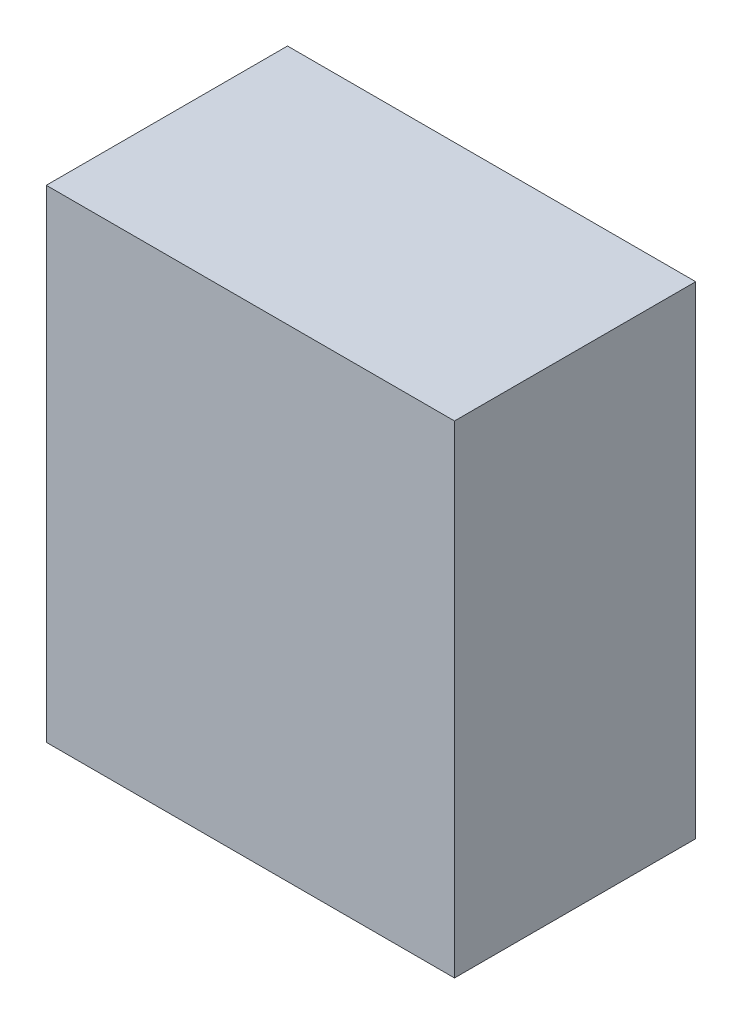
ISO-10303-21;
HEADER;
FILE_DESCRIPTION(('STEP AP214'),'2;1');
FILE_NAME('part.step','',(''),(''),'','','');
FILE_SCHEMA(('AUTOMOTIVE_DESIGN { 1 0 10303 214 1 1 1 1 }'));
ENDSEC;
DATA;
#1=APPLICATION_CONTEXT('core data for automotive mechanical design processes');
#2=APPLICATION_PROTOCOL_DEFINITION('international standard','automotive_design',2000,#1);
#3=PRODUCT_CONTEXT('',#1,'mechanical');
#4=PRODUCT('Part','Part','',(#3));
#5=PRODUCT_RELATED_PRODUCT_CATEGORY('part','',(#4));
#6=PRODUCT_DEFINITION_FORMATION('','',#4);
#7=PRODUCT_DEFINITION_CONTEXT('part definition',#1,'design');
#8=PRODUCT_DEFINITION('design','',#6,#7);
#9=PRODUCT_DEFINITION_SHAPE('','',#8);
#10=(LENGTH_UNIT() NAMED_UNIT(*) SI_UNIT(.MILLI.,.METRE.));
#11=(NAMED_UNIT(*) PLANE_ANGLE_UNIT() SI_UNIT($,.RADIAN.));
#12=(NAMED_UNIT(*) SI_UNIT($,.STERADIAN.) SOLID_ANGLE_UNIT());
#13=UNCERTAINTY_MEASURE_WITH_UNIT(LENGTH_MEASURE(1.E-05),#10,'distance_accuracy_value','');
#14=(GEOMETRIC_REPRESENTATION_CONTEXT(3) GLOBAL_UNCERTAINTY_ASSIGNED_CONTEXT((#13)) GLOBAL_UNIT_ASSIGNED_CONTEXT((#10,
#11,#12)) REPRESENTATION_CONTEXT('',''));
#15=CARTESIAN_POINT('',(0.,0.,0.));
#16=DIRECTION('',(0.,0.,1.));
#17=DIRECTION('',(1.,0.,0.));
#18=AXIS2_PLACEMENT_3D('',#15,#16,#17);
#19=CARTESIAN_POINT('',(4.15957446808511,-6.9967362482587,10.));
#20=DIRECTION('',(0.,-1.,0.));
#21=DIRECTION('',(1.,0.,0.));
#22=AXIS2_PLACEMENT_3D('',#19,#20,#21);
#23=PLANE('',#22);
#24=DIRECTION('',(-1.,0.,0.));
#25=VECTOR('',#24,1.);
#26=CARTESIAN_POINT('',(4.15957446808511,-6.9967362482587,0.));
#27=LINE('',#26,#25);
#28=CARTESIAN_POINT('',(4.15957446808511,-6.9967362482587,0.));
#29=VERTEX_POINT('',#28);
#30=CARTESIAN_POINT('',(-11.8404255319149,-6.9967362482587,0.));
#31=VERTEX_POINT('',#30);
#32=EDGE_CURVE('E160',#29,#31,#27,.T.);
#33=ORIENTED_EDGE('',*,*,#32,.T.);
#34=DIRECTION('',(0.,0.,-1.));
#35=VECTOR('',#34,1.);
#36=CARTESIAN_POINT('',(-11.8404255319149,-6.9967362482587,10.));
#37=LINE('',#36,#35);
#38=CARTESIAN_POINT('',(-11.8404255319149,-6.9967362482587,10.));
#39=VERTEX_POINT('',#38);
#40=EDGE_CURVE('E11',#39,#31,#37,.T.);
#41=ORIENTED_EDGE('',*,*,#40,.F.);
#42=DIRECTION('',(-1.,0.,0.));
#43=VECTOR('',#42,1.);
#44=CARTESIAN_POINT('',(4.15957446808511,-6.9967362482587,10.));
#45=LINE('',#44,#43);
#46=CARTESIAN_POINT('',(4.15957446808511,-6.9967362482587,10.));
#47=VERTEX_POINT('',#46);
#48=EDGE_CURVE('E148',#47,#39,#45,.T.);
#49=ORIENTED_EDGE('',*,*,#48,.F.);
#50=DIRECTION('',(0.,0.,-1.));
#51=VECTOR('',#50,1.);
#52=CARTESIAN_POINT('',(4.15957446808511,-6.9967362482587,10.));
#53=LINE('',#52,#51);
#54=EDGE_CURVE('E159',#47,#29,#53,.T.);
#55=ORIENTED_EDGE('',*,*,#54,.T.);
#56=EDGE_LOOP('',(#33,#41,#49,#55));
#57=FACE_BOUND('',#56,.T.);
#58=ADVANCED_FACE('F39',(#57),#23,.F.);
#59=CARTESIAN_POINT('',(-11.8404255319149,-6.9967362482587,10.));
#60=DIRECTION('',(-1.,0.,0.));
#61=DIRECTION('',(0.,0.,1.));
#62=AXIS2_PLACEMENT_3D('',#59,#60,#61);
#63=PLANE('',#62);
#64=DIRECTION('',(0.,1.,0.));
#65=VECTOR('',#64,1.);
#66=CARTESIAN_POINT('',(-11.8404255319149,-6.9967362482587,0.));
#67=LINE('',#66,#65);
#68=CARTESIAN_POINT('',(-11.8404255319149,9.0032637517413,0.));
#69=VERTEX_POINT('',#68);
#70=EDGE_CURVE('E164',#31,#69,#67,.T.);
#71=ORIENTED_EDGE('',*,*,#70,.T.);
#72=DIRECTION('',(0.,0.,-1.));
#73=VECTOR('',#72,1.);
#74=CARTESIAN_POINT('',(-11.8404255319149,9.0032637517413,10.));
#75=LINE('',#74,#73);
#76=CARTESIAN_POINT('',(-11.8404255319149,9.0032637517413,10.));
#77=VERTEX_POINT('',#76);
#78=EDGE_CURVE('E48',#77,#69,#75,.T.);
#79=ORIENTED_EDGE('',*,*,#78,.F.);
#80=DIRECTION('',(0.,1.,0.));
#81=VECTOR('',#80,1.);
#82=CARTESIAN_POINT('',(-11.8404255319149,-6.9967362482587,10.));
#83=LINE('',#82,#81);
#84=EDGE_CURVE('E104',#39,#77,#83,.T.);
#85=ORIENTED_EDGE('',*,*,#84,.F.);
#86=ORIENTED_EDGE('',*,*,#40,.T.);
#87=EDGE_LOOP('',(#71,#79,#85,#86));
#88=FACE_BOUND('',#87,.T.);
#89=ADVANCED_FACE('F258',(#88),#63,.F.);
#90=CARTESIAN_POINT('',(-11.8404255319149,9.0032637517413,10.));
#91=DIRECTION('',(0.,-1.,0.));
#92=DIRECTION('',(0.,0.,-1.));
#93=AXIS2_PLACEMENT_3D('',#90,#91,#92);
#94=PLANE('',#93);
#95=DIRECTION('',(-1.,0.,0.));
#96=VECTOR('',#95,1.);
#97=CARTESIAN_POINT('',(-11.8404255319149,9.0032637517413,0.));
#98=LINE('',#97,#96);
#99=CARTESIAN_POINT('',(-14.8404255319149,9.0032637517413,0.));
#100=VERTEX_POINT('',#99);
#101=EDGE_CURVE('E119',#69,#100,#98,.T.);
#102=ORIENTED_EDGE('',*,*,#101,.T.);
#103=DIRECTION('',(0.,0.,-1.));
#104=VECTOR('',#103,1.);
#105=CARTESIAN_POINT('',(-14.8404255319149,9.0032637517413,10.));
#106=LINE('',#105,#104);
#107=CARTESIAN_POINT('',(-14.8404255319149,9.0032637517413,10.));
#108=VERTEX_POINT('',#107);
#109=EDGE_CURVE('E113',#108,#100,#106,.T.);
#110=ORIENTED_EDGE('',*,*,#109,.F.);
#111=DIRECTION('',(-1.,0.,0.));
#112=VECTOR('',#111,1.);
#113=CARTESIAN_POINT('',(-11.8404255319149,9.0032637517413,10.));
#114=LINE('',#113,#112);
#115=EDGE_CURVE('E117',#77,#108,#114,.T.);
#116=ORIENTED_EDGE('',*,*,#115,.F.);
#117=ORIENTED_EDGE('',*,*,#78,.T.);
#118=EDGE_LOOP('',(#102,#110,#116,#117));
#119=FACE_BOUND('',#118,.T.);
#120=ADVANCED_FACE('F115',(#119),#94,.F.);
#121=CARTESIAN_POINT('',(-14.8404255319149,-9.9967362482587,10.));
#122=DIRECTION('',(0.,1.,0.));
#123=DIRECTION('',(0.,0.,1.));
#124=AXIS2_PLACEMENT_3D('',#121,#122,#123);
#125=PLANE('',#124);
#126=DIRECTION('',(1.,0.,0.));
#127=VECTOR('',#126,1.);
#128=CARTESIAN_POINT('',(-14.8404255319149,-9.9967362482587,0.));
#129=LINE('',#128,#127);
#130=CARTESIAN_POINT('',(-14.8404255319149,-9.9967362482587,0.));
#131=VERTEX_POINT('',#130);
#132=CARTESIAN_POINT('',(7.15957446808511,-9.9967362482587,0.));
#133=VERTEX_POINT('',#132);
#134=EDGE_CURVE('E172',#131,#133,#129,.T.);
#135=ORIENTED_EDGE('',*,*,#134,.T.);
#136=DIRECTION('',(0.,0.,-1.));
#137=VECTOR('',#136,1.);
#138=CARTESIAN_POINT('',(7.15957446808511,-9.9967362482587,10.));
#139=LINE('',#138,#137);
#140=CARTESIAN_POINT('',(7.15957446808511,-9.9967362482587,13.));
#141=VERTEX_POINT('',#140);
#142=EDGE_CURVE('E202',#141,#133,#139,.T.);
#143=ORIENTED_EDGE('',*,*,#142,.F.);
#144=DIRECTION('',(1.,0.,0.));
#145=VECTOR('',#144,1.);
#146=CARTESIAN_POINT('',(7.15957446808511,-9.9967362482587,13.));
#147=LINE('',#146,#145);
#148=CARTESIAN_POINT('',(-14.8404255319149,-9.9967362482587,13.));
#149=VERTEX_POINT('',#148);
#150=EDGE_CURVE('E142',#149,#141,#147,.T.);
#151=ORIENTED_EDGE('',*,*,#150,.F.);
#152=DIRECTION('',(0.,0.,-1.));
#153=VECTOR('',#152,1.);
#154=CARTESIAN_POINT('',(-14.8404255319149,-9.9967362482587,10.));
#155=LINE('',#154,#153);
#156=EDGE_CURVE('E124',#149,#131,#155,.T.);
#157=ORIENTED_EDGE('',*,*,#156,.T.);
#158=EDGE_LOOP('',(#135,#143,#151,#157));
#159=FACE_BOUND('',#158,.T.);
#160=ADVANCED_FACE('F219',(#159),#125,.F.);
#161=CARTESIAN_POINT('',(7.15957446808511,-9.9967362482587,10.));
#162=DIRECTION('',(-1.,0.,0.));
#163=DIRECTION('',(0.,0.,1.));
#164=AXIS2_PLACEMENT_3D('',#161,#162,#163);
#165=PLANE('',#164);
#166=DIRECTION('',(0.,1.,0.));
#167=VECTOR('',#166,1.);
#168=CARTESIAN_POINT('',(7.15957446808511,-9.9967362482587,0.));
#169=LINE('',#168,#167);
#170=CARTESIAN_POINT('',(7.15957446808511,16.0032637517413,0.));
#171=VERTEX_POINT('',#170);
#172=EDGE_CURVE('E175',#133,#171,#169,.T.);
#173=ORIENTED_EDGE('',*,*,#172,.T.);
#174=DIRECTION('',(0.,0.,-1.));
#175=VECTOR('',#174,1.);
#176=CARTESIAN_POINT('',(7.15957446808511,16.0032637517413,10.));
#177=LINE('',#176,#175);
#178=CARTESIAN_POINT('',(7.15957446808511,16.0032637517413,13.));
#179=VERTEX_POINT('',#178);
#180=EDGE_CURVE('E198',#179,#171,#177,.T.);
#181=ORIENTED_EDGE('',*,*,#180,.F.);
#182=DIRECTION('',(0.,1.,0.));
#183=VECTOR('',#182,1.);
#184=CARTESIAN_POINT('',(7.15957446808511,16.0032637517413,13.));
#185=LINE('',#184,#183);
#186=EDGE_CURVE('E228',#141,#179,#185,.T.);
#187=ORIENTED_EDGE('',*,*,#186,.F.);
#188=ORIENTED_EDGE('',*,*,#142,.T.);
#189=EDGE_LOOP('',(#173,#181,#187,#188));
#190=FACE_BOUND('',#189,.T.);
#191=ADVANCED_FACE('F243',(#190),#165,.F.);
#192=CARTESIAN_POINT('',(7.15957446808511,16.0032637517413,10.));
#193=DIRECTION('',(0.,-1.,0.));
#194=DIRECTION('',(1.,0.,0.));
#195=AXIS2_PLACEMENT_3D('',#192,#193,#194);
#196=PLANE('',#195);
#197=DIRECTION('',(-1.,0.,0.));
#198=VECTOR('',#197,1.);
#199=CARTESIAN_POINT('',(7.15957446808511,16.0032637517413,0.));
#200=LINE('',#199,#198);
#201=CARTESIAN_POINT('',(-14.8404255319149,16.0032637517413,0.));
#202=VERTEX_POINT('',#201);
#203=EDGE_CURVE('E178',#171,#202,#200,.T.);
#204=ORIENTED_EDGE('',*,*,#203,.T.);
#205=DIRECTION('',(0.,0.,-1.));
#206=VECTOR('',#205,1.);
#207=CARTESIAN_POINT('',(-14.8404255319149,16.0032637517413,10.));
#208=LINE('',#207,#206);
#209=CARTESIAN_POINT('',(-14.8404255319149,16.0032637517413,13.));
#210=VERTEX_POINT('',#209);
#211=EDGE_CURVE('E194',#210,#202,#208,.T.);
#212=ORIENTED_EDGE('',*,*,#211,.F.);
#213=DIRECTION('',(-1.,0.,0.));
#214=VECTOR('',#213,1.);
#215=CARTESIAN_POINT('',(-14.8404255319149,16.0032637517413,13.));
#216=LINE('',#215,#214);
#217=EDGE_CURVE('E146',#179,#210,#216,.T.);
#218=ORIENTED_EDGE('',*,*,#217,.F.);
#219=ORIENTED_EDGE('',*,*,#180,.T.);
#220=EDGE_LOOP('',(#204,#212,#218,#219));
#221=FACE_BOUND('',#220,.T.);
#222=ADVANCED_FACE('F246',(#221),#196,.F.);
#223=CARTESIAN_POINT('',(-14.8404255319149,16.0032637517413,10.));
#224=DIRECTION('',(1.,0.,0.));
#225=DIRECTION('',(0.,1.,0.));
#226=AXIS2_PLACEMENT_3D('',#223,#224,#225);
#227=PLANE('',#226);
#228=DIRECTION('',(0.,-1.,0.));
#229=VECTOR('',#228,1.);
#230=CARTESIAN_POINT('',(-14.8404255319149,16.0032637517413,0.));
#231=LINE('',#230,#229);
#232=CARTESIAN_POINT('',(-14.8404255319149,13.0032637517413,0.));
#233=VERTEX_POINT('',#232);
#234=EDGE_CURVE('E181',#202,#233,#231,.T.);
#235=ORIENTED_EDGE('',*,*,#234,.T.);
#236=DIRECTION('',(0.,0.,-1.));
#237=VECTOR('',#236,1.);
#238=CARTESIAN_POINT('',(-14.8404255319149,13.0032637517413,10.));
#239=LINE('',#238,#237);
#240=CARTESIAN_POINT('',(-14.8404255319149,13.0032637517413,10.));
#241=VERTEX_POINT('',#240);
#242=EDGE_CURVE('E136',#241,#233,#239,.T.);
#243=ORIENTED_EDGE('',*,*,#242,.F.);
#244=DIRECTION('',(0.,-1.,0.));
#245=VECTOR('',#244,1.);
#246=CARTESIAN_POINT('',(-14.8404255319149,-9.9967362482587,10.));
#247=LINE('',#246,#245);
#248=EDGE_CURVE('E130',#241,#108,#247,.T.);
#249=ORIENTED_EDGE('',*,*,#248,.T.);
#250=ORIENTED_EDGE('',*,*,#109,.T.);
#251=DIRECTION('',(0.,-1.,0.));
#252=VECTOR('',#251,1.);
#253=CARTESIAN_POINT('',(-14.8404255319149,9.0032637517413,0.));
#254=LINE('',#253,#252);
#255=EDGE_CURVE('E169',#100,#131,#254,.T.);
#256=ORIENTED_EDGE('',*,*,#255,.T.);
#257=ORIENTED_EDGE('',*,*,#156,.F.);
#258=DIRECTION('',(0.,-1.,0.));
#259=VECTOR('',#258,1.);
#260=CARTESIAN_POINT('',(-14.8404255319149,-9.9967362482587,13.));
#261=LINE('',#260,#259);
#262=EDGE_CURVE('E138',#210,#149,#261,.T.);
#263=ORIENTED_EDGE('',*,*,#262,.F.);
#264=ORIENTED_EDGE('',*,*,#211,.T.);
#265=EDGE_LOOP('',(#235,#243,#249,#250,#256,#257,#263,#264));
#266=FACE_BOUND('',#265,.T.);
#267=ADVANCED_FACE('F135',(#266),#227,.F.);
#268=CARTESIAN_POINT('',(-14.8404255319149,13.0032637517413,10.));
#269=DIRECTION('',(0.,1.,0.));
#270=DIRECTION('',(-1.,0.,0.));
#271=AXIS2_PLACEMENT_3D('',#268,#269,#270);
#272=PLANE('',#271);
#273=DIRECTION('',(1.,0.,0.));
#274=VECTOR('',#273,1.);
#275=CARTESIAN_POINT('',(-14.8404255319149,13.0032637517413,0.));
#276=LINE('',#275,#274);
#277=CARTESIAN_POINT('',(4.1595744680851,13.0032637517413,0.));
#278=VERTEX_POINT('',#277);
#279=EDGE_CURVE('E90',#233,#278,#276,.T.);
#280=ORIENTED_EDGE('',*,*,#279,.T.);
#281=DIRECTION('',(0.,0.,-1.));
#282=VECTOR('',#281,1.);
#283=CARTESIAN_POINT('',(4.1595744680851,13.0032637517413,10.));
#284=LINE('',#283,#282);
#285=CARTESIAN_POINT('',(4.1595744680851,13.0032637517413,10.));
#286=VERTEX_POINT('',#285);
#287=EDGE_CURVE('E56',#286,#278,#284,.T.);
#288=ORIENTED_EDGE('',*,*,#287,.F.);
#289=DIRECTION('',(1.,0.,0.));
#290=VECTOR('',#289,1.);
#291=CARTESIAN_POINT('',(-14.8404255319149,13.0032637517413,10.));
#292=LINE('',#291,#290);
#293=EDGE_CURVE('E133',#241,#286,#292,.T.);
#294=ORIENTED_EDGE('',*,*,#293,.F.);
#295=ORIENTED_EDGE('',*,*,#242,.T.);
#296=EDGE_LOOP('',(#280,#288,#294,#295));
#297=FACE_BOUND('',#296,.T.);
#298=ADVANCED_FACE('F254',(#297),#272,.F.);
#299=CARTESIAN_POINT('',(4.1595744680851,13.0032637517413,10.));
#300=DIRECTION('',(1.,0.,0.));
#301=DIRECTION('',(0.,1.,0.));
#302=AXIS2_PLACEMENT_3D('',#299,#300,#301);
#303=PLANE('',#302);
#304=DIRECTION('',(0.,-1.,0.));
#305=VECTOR('',#304,1.);
#306=CARTESIAN_POINT('',(4.1595744680851,13.0032637517413,0.));
#307=LINE('',#306,#305);
#308=EDGE_CURVE('E96',#278,#29,#307,.T.);
#309=ORIENTED_EDGE('',*,*,#308,.T.);
#310=ORIENTED_EDGE('',*,*,#54,.F.);
#311=DIRECTION('',(0.,-1.,0.));
#312=VECTOR('',#311,1.);
#313=CARTESIAN_POINT('',(4.1595744680851,13.0032637517413,10.));
#314=LINE('',#313,#312);
#315=EDGE_CURVE('E155',#286,#47,#314,.T.);
#316=ORIENTED_EDGE('',*,*,#315,.F.);
#317=ORIENTED_EDGE('',*,*,#287,.T.);
#318=EDGE_LOOP('',(#309,#310,#316,#317));
#319=FACE_BOUND('',#318,.T.);
#320=ADVANCED_FACE('F263',(#319),#303,.F.);
#321=CARTESIAN_POINT('',(0.,0.,0.));
#322=DIRECTION('',(0.,0.,-1.));
#323=DIRECTION('',(-1.,0.,0.));
#324=AXIS2_PLACEMENT_3D('',#321,#322,#323);
#325=PLANE('',#324);
#326=ORIENTED_EDGE('',*,*,#32,.F.);
#327=ORIENTED_EDGE('',*,*,#308,.F.);
#328=ORIENTED_EDGE('',*,*,#279,.F.);
#329=ORIENTED_EDGE('',*,*,#234,.F.);
#330=ORIENTED_EDGE('',*,*,#203,.F.);
#331=ORIENTED_EDGE('',*,*,#172,.F.);
#332=ORIENTED_EDGE('',*,*,#134,.F.);
#333=ORIENTED_EDGE('',*,*,#255,.F.);
#334=ORIENTED_EDGE('',*,*,#101,.F.);
#335=ORIENTED_EDGE('',*,*,#70,.F.);
#336=EDGE_LOOP('',(#326,#327,#328,#329,#330,#331,#332,#333,#334,#335));
#337=FACE_BOUND('',#336,.T.);
#338=ADVANCED_FACE('F211',(#337),#325,.T.);
#339=CARTESIAN_POINT('',(0.,0.,13.));
#340=DIRECTION('',(0.,0.,-1.));
#341=DIRECTION('',(-1.,0.,0.));
#342=AXIS2_PLACEMENT_3D('',#339,#340,#341);
#343=PLANE('',#342);
#344=ORIENTED_EDGE('',*,*,#262,.T.);
#345=ORIENTED_EDGE('',*,*,#150,.T.);
#346=ORIENTED_EDGE('',*,*,#186,.T.);
#347=ORIENTED_EDGE('',*,*,#217,.T.);
#348=EDGE_LOOP('',(#344,#345,#346,#347));
#349=FACE_BOUND('',#348,.T.);
#350=ADVANCED_FACE('F231',(#349),#343,.F.);
#351=CARTESIAN_POINT('',(0.,0.,10.));
#352=DIRECTION('',(0.,0.,-1.));
#353=DIRECTION('',(-1.,0.,0.));
#354=AXIS2_PLACEMENT_3D('',#351,#352,#353);
#355=PLANE('',#354);
#356=ORIENTED_EDGE('',*,*,#84,.T.);
#357=ORIENTED_EDGE('',*,*,#115,.T.);
#358=ORIENTED_EDGE('',*,*,#248,.F.);
#359=ORIENTED_EDGE('',*,*,#293,.T.);
#360=ORIENTED_EDGE('',*,*,#315,.T.);
#361=ORIENTED_EDGE('',*,*,#48,.T.);
#362=EDGE_LOOP('',(#356,#357,#358,#359,#360,#361));
#363=FACE_BOUND('',#362,.T.);
#364=ADVANCED_FACE('F128',(#363),#355,.T.);
#365=CLOSED_SHELL('',(#58,#89,#120,#160,#191,#222,#267,#298,#320,#338,#350,#364));
#366=MANIFOLD_SOLID_BREP('B2',#365);
#367=ADVANCED_BREP_SHAPE_REPRESENTATION('',(#18,#366),#14);
#368=SHAPE_DEFINITION_REPRESENTATION(#9,#367);
ENDSEC;
END-ISO-10303-21;
